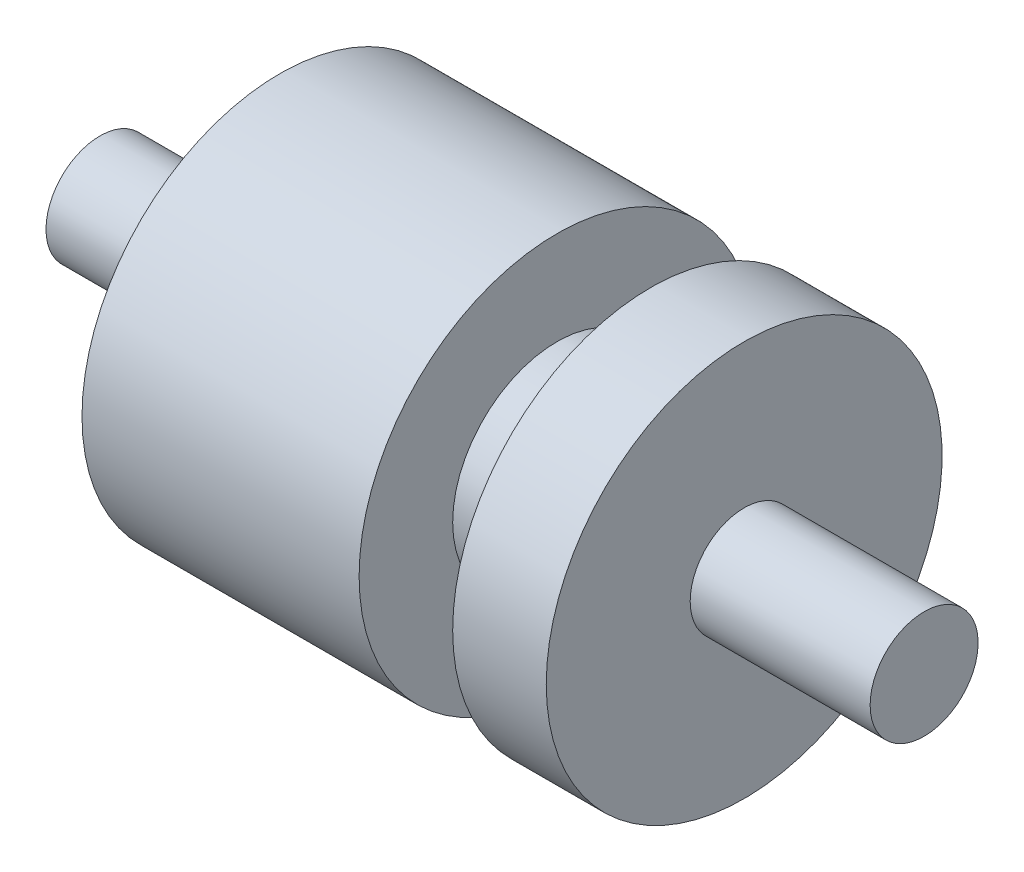
ISO-10303-21;
HEADER;
FILE_DESCRIPTION(('STEP AP214'),'2;1');
FILE_NAME('part.step','',(''),(''),'','','');
FILE_SCHEMA(('AUTOMOTIVE_DESIGN { 1 0 10303 214 1 1 1 1 }'));
ENDSEC;
DATA;
#1=APPLICATION_CONTEXT('core data for automotive mechanical design processes');
#2=APPLICATION_PROTOCOL_DEFINITION('international standard','automotive_design',2000,#1);
#3=PRODUCT_CONTEXT('',#1,'mechanical');
#4=PRODUCT('Part','Part','',(#3));
#5=PRODUCT_RELATED_PRODUCT_CATEGORY('part','',(#4));
#6=PRODUCT_DEFINITION_FORMATION('','',#4);
#7=PRODUCT_DEFINITION_CONTEXT('part definition',#1,'design');
#8=PRODUCT_DEFINITION('design','',#6,#7);
#9=PRODUCT_DEFINITION_SHAPE('','',#8);
#10=(LENGTH_UNIT() NAMED_UNIT(*) SI_UNIT(.MILLI.,.METRE.));
#11=(NAMED_UNIT(*) PLANE_ANGLE_UNIT() SI_UNIT($,.RADIAN.));
#12=(NAMED_UNIT(*) SI_UNIT($,.STERADIAN.) SOLID_ANGLE_UNIT());
#13=UNCERTAINTY_MEASURE_WITH_UNIT(LENGTH_MEASURE(1.E-05),#10,'distance_accuracy_value','');
#14=(GEOMETRIC_REPRESENTATION_CONTEXT(3) GLOBAL_UNCERTAINTY_ASSIGNED_CONTEXT((#13)) GLOBAL_UNIT_ASSIGNED_CONTEXT((#10,
#11,#12)) REPRESENTATION_CONTEXT('',''));
#15=CARTESIAN_POINT('',(0.,0.,0.));
#16=DIRECTION('',(0.,0.,1.));
#17=DIRECTION('',(1.,0.,0.));
#18=AXIS2_PLACEMENT_3D('',#15,#16,#17);
#19=CARTESIAN_POINT('',(-22.9,1.5,0.));
#20=DIRECTION('',(1.,0.,0.));
#21=DIRECTION('',(0.,0.,-1.));
#22=AXIS2_PLACEMENT_3D('',#19,#20,#21);
#23=PLANE('',#22);
#24=CARTESIAN_POINT('',(-22.9,0.,0.));
#25=DIRECTION('',(-1.,0.,0.));
#26=DIRECTION('',(0.,0.,1.));
#27=AXIS2_PLACEMENT_3D('',#24,#25,#26);
#28=CIRCLE('',#27,1.5);
#29=CARTESIAN_POINT('',(-22.9,0.,1.5));
#30=VERTEX_POINT('',#29);
#31=EDGE_CURVE('E65',#30,#30,#28,.T.);
#32=ORIENTED_EDGE('',*,*,#31,.T.);
#33=EDGE_LOOP('',(#32));
#34=FACE_BOUND('',#33,.T.);
#35=ADVANCED_FACE('F31',(#34),#23,.F.);
#36=CARTESIAN_POINT('',(0.,0.,0.));
#37=DIRECTION('',(-1.,0.,0.));
#38=DIRECTION('',(0.,0.,1.));
#39=AXIS2_PLACEMENT_3D('',#36,#37,#38);
#40=PLANE('',#39);
#41=CARTESIAN_POINT('',(0.,0.,0.));
#42=DIRECTION('',(-1.,0.,0.));
#43=DIRECTION('',(0.,0.,1.));
#44=AXIS2_PLACEMENT_3D('',#41,#42,#43);
#45=CIRCLE('',#44,1.5);
#46=CARTESIAN_POINT('',(0.,0.,1.5));
#47=VERTEX_POINT('',#46);
#48=EDGE_CURVE('E10',#47,#47,#45,.T.);
#49=ORIENTED_EDGE('',*,*,#48,.F.);
#50=EDGE_LOOP('',(#49));
#51=FACE_BOUND('',#50,.T.);
#52=ADVANCED_FACE('F119',(#51),#40,.F.);
#53=CARTESIAN_POINT('',(-68.0943285523418,0.,0.));
#54=DIRECTION('',(-1.,0.,0.));
#55=DIRECTION('',(0.,0.,1.));
#56=AXIS2_PLACEMENT_3D('',#53,#54,#55);
#57=CYLINDRICAL_SURFACE('',#56,1.5);
#58=CARTESIAN_POINT('',(-5.00000000000002,0.,0.));
#59=DIRECTION('',(-1.,0.,0.));
#60=DIRECTION('',(0.,0.,1.));
#61=AXIS2_PLACEMENT_3D('',#58,#59,#60);
#62=CIRCLE('',#61,1.5);
#63=CARTESIAN_POINT('',(-5.00000000000002,0.,1.5));
#64=VERTEX_POINT('',#63);
#65=EDGE_CURVE('E37',#64,#64,#62,.T.);
#66=ORIENTED_EDGE('',*,*,#65,.F.);
#67=EDGE_LOOP('',(#66));
#68=FACE_BOUND('',#67,.T.);
#69=ORIENTED_EDGE('',*,*,#48,.T.);
#70=EDGE_LOOP('',(#69));
#71=FACE_BOUND('',#70,.T.);
#72=ADVANCED_FACE('F114',(#68,#71),#57,.T.);
#73=CARTESIAN_POINT('',(-5.00000000000002,5.5,0.));
#74=DIRECTION('',(-1.,0.,0.));
#75=DIRECTION('',(0.,0.,1.));
#76=AXIS2_PLACEMENT_3D('',#73,#74,#75);
#77=PLANE('',#76);
#78=CARTESIAN_POINT('',(-5.00000000000002,0.,0.));
#79=DIRECTION('',(-1.,0.,0.));
#80=DIRECTION('',(0.,0.,1.));
#81=AXIS2_PLACEMENT_3D('',#78,#79,#80);
#82=CIRCLE('',#81,5.5);
#83=CARTESIAN_POINT('',(-5.00000000000002,0.,5.5));
#84=VERTEX_POINT('',#83);
#85=EDGE_CURVE('E41',#84,#84,#82,.T.);
#86=ORIENTED_EDGE('',*,*,#85,.F.);
#87=EDGE_LOOP('',(#86));
#88=FACE_BOUND('',#87,.T.);
#89=ORIENTED_EDGE('',*,*,#65,.T.);
#90=EDGE_LOOP('',(#89));
#91=FACE_BOUND('',#90,.T.);
#92=ADVANCED_FACE('F109',(#88,#91),#77,.F.);
#93=CARTESIAN_POINT('',(-68.0943285523418,0.,0.));
#94=DIRECTION('',(-1.,0.,0.));
#95=DIRECTION('',(0.,0.,1.));
#96=AXIS2_PLACEMENT_3D('',#93,#94,#95);
#97=CYLINDRICAL_SURFACE('',#96,5.5);
#98=CARTESIAN_POINT('',(-7.60000000000002,0.,0.));
#99=DIRECTION('',(-1.,0.,0.));
#100=DIRECTION('',(0.,0.,1.));
#101=AXIS2_PLACEMENT_3D('',#98,#99,#100);
#102=CIRCLE('',#101,5.5);
#103=CARTESIAN_POINT('',(-7.60000000000002,0.,5.5));
#104=VERTEX_POINT('',#103);
#105=EDGE_CURVE('E45',#104,#104,#102,.T.);
#106=ORIENTED_EDGE('',*,*,#105,.F.);
#107=EDGE_LOOP('',(#106));
#108=FACE_BOUND('',#107,.T.);
#109=ORIENTED_EDGE('',*,*,#85,.T.);
#110=EDGE_LOOP('',(#109));
#111=FACE_BOUND('',#110,.T.);
#112=ADVANCED_FACE('F103',(#108,#111),#97,.T.);
#113=CARTESIAN_POINT('',(-7.60000000000002,2.9,0.));
#114=DIRECTION('',(1.,0.,0.));
#115=DIRECTION('',(0.,0.,-1.));
#116=AXIS2_PLACEMENT_3D('',#113,#114,#115);
#117=PLANE('',#116);
#118=CARTESIAN_POINT('',(-7.60000000000002,0.,0.));
#119=DIRECTION('',(-1.,0.,0.));
#120=DIRECTION('',(0.,0.,1.));
#121=AXIS2_PLACEMENT_3D('',#118,#119,#120);
#122=CIRCLE('',#121,2.9);
#123=CARTESIAN_POINT('',(-7.60000000000002,0.,2.9));
#124=VERTEX_POINT('',#123);
#125=EDGE_CURVE('E50',#124,#124,#122,.T.);
#126=ORIENTED_EDGE('',*,*,#125,.F.);
#127=EDGE_LOOP('',(#126));
#128=FACE_BOUND('',#127,.T.);
#129=ORIENTED_EDGE('',*,*,#105,.T.);
#130=EDGE_LOOP('',(#129));
#131=FACE_BOUND('',#130,.T.);
#132=ADVANCED_FACE('F97',(#128,#131),#117,.F.);
#133=CARTESIAN_POINT('',(-68.0943285523418,0.,0.));
#134=DIRECTION('',(-1.,0.,0.));
#135=DIRECTION('',(0.,0.,1.));
#136=AXIS2_PLACEMENT_3D('',#133,#134,#135);
#137=CYLINDRICAL_SURFACE('',#136,2.9);
#138=CARTESIAN_POINT('',(-10.2,0.,0.));
#139=DIRECTION('',(-1.,0.,0.));
#140=DIRECTION('',(0.,0.,1.));
#141=AXIS2_PLACEMENT_3D('',#138,#139,#140);
#142=CIRCLE('',#141,2.9);
#143=CARTESIAN_POINT('',(-10.2,0.,2.9));
#144=VERTEX_POINT('',#143);
#145=EDGE_CURVE('E53',#144,#144,#142,.T.);
#146=ORIENTED_EDGE('',*,*,#145,.F.);
#147=EDGE_LOOP('',(#146));
#148=FACE_BOUND('',#147,.T.);
#149=ORIENTED_EDGE('',*,*,#125,.T.);
#150=EDGE_LOOP('',(#149));
#151=FACE_BOUND('',#150,.T.);
#152=ADVANCED_FACE('F91',(#148,#151),#137,.T.);
#153=CARTESIAN_POINT('',(-10.2,5.5,0.));
#154=DIRECTION('',(-1.,0.,0.));
#155=DIRECTION('',(0.,0.,1.));
#156=AXIS2_PLACEMENT_3D('',#153,#154,#155);
#157=PLANE('',#156);
#158=CARTESIAN_POINT('',(-10.2,0.,0.));
#159=DIRECTION('',(-1.,0.,0.));
#160=DIRECTION('',(0.,0.,1.));
#161=AXIS2_PLACEMENT_3D('',#158,#159,#160);
#162=CIRCLE('',#161,5.5);
#163=CARTESIAN_POINT('',(-10.2,0.,5.5));
#164=VERTEX_POINT('',#163);
#165=EDGE_CURVE('E56',#164,#164,#162,.T.);
#166=ORIENTED_EDGE('',*,*,#165,.F.);
#167=EDGE_LOOP('',(#166));
#168=FACE_BOUND('',#167,.T.);
#169=ORIENTED_EDGE('',*,*,#145,.T.);
#170=EDGE_LOOP('',(#169));
#171=FACE_BOUND('',#170,.T.);
#172=ADVANCED_FACE('F85',(#168,#171),#157,.F.);
#173=CARTESIAN_POINT('',(-68.0943285523418,0.,0.));
#174=DIRECTION('',(-1.,0.,0.));
#175=DIRECTION('',(0.,0.,1.));
#176=AXIS2_PLACEMENT_3D('',#173,#174,#175);
#177=CYLINDRICAL_SURFACE('',#176,5.5);
#178=CARTESIAN_POINT('',(-17.9,0.,0.));
#179=DIRECTION('',(-1.,0.,0.));
#180=DIRECTION('',(0.,0.,1.));
#181=AXIS2_PLACEMENT_3D('',#178,#179,#180);
#182=CIRCLE('',#181,5.5);
#183=CARTESIAN_POINT('',(-17.9,0.,5.5));
#184=VERTEX_POINT('',#183);
#185=EDGE_CURVE('E59',#184,#184,#182,.T.);
#186=ORIENTED_EDGE('',*,*,#185,.F.);
#187=EDGE_LOOP('',(#186));
#188=FACE_BOUND('',#187,.T.);
#189=ORIENTED_EDGE('',*,*,#165,.T.);
#190=EDGE_LOOP('',(#189));
#191=FACE_BOUND('',#190,.T.);
#192=ADVANCED_FACE('F79',(#188,#191),#177,.T.);
#193=CARTESIAN_POINT('',(-17.9,1.5,0.));
#194=DIRECTION('',(1.,0.,0.));
#195=DIRECTION('',(0.,0.,-1.));
#196=AXIS2_PLACEMENT_3D('',#193,#194,#195);
#197=PLANE('',#196);
#198=CARTESIAN_POINT('',(-17.9,0.,0.));
#199=DIRECTION('',(-1.,0.,0.));
#200=DIRECTION('',(0.,0.,1.));
#201=AXIS2_PLACEMENT_3D('',#198,#199,#200);
#202=CIRCLE('',#201,1.5);
#203=CARTESIAN_POINT('',(-17.9,0.,1.5));
#204=VERTEX_POINT('',#203);
#205=EDGE_CURVE('E62',#204,#204,#202,.T.);
#206=ORIENTED_EDGE('',*,*,#205,.F.);
#207=EDGE_LOOP('',(#206));
#208=FACE_BOUND('',#207,.T.);
#209=ORIENTED_EDGE('',*,*,#185,.T.);
#210=EDGE_LOOP('',(#209));
#211=FACE_BOUND('',#210,.T.);
#212=ADVANCED_FACE('F73',(#208,#211),#197,.F.);
#213=CARTESIAN_POINT('',(-68.0943285523418,0.,0.));
#214=DIRECTION('',(-1.,0.,0.));
#215=DIRECTION('',(0.,0.,1.));
#216=AXIS2_PLACEMENT_3D('',#213,#214,#215);
#217=CYLINDRICAL_SURFACE('',#216,1.5);
#218=ORIENTED_EDGE('',*,*,#31,.F.);
#219=EDGE_LOOP('',(#218));
#220=FACE_BOUND('',#219,.T.);
#221=ORIENTED_EDGE('',*,*,#205,.T.);
#222=EDGE_LOOP('',(#221));
#223=FACE_BOUND('',#222,.T.);
#224=ADVANCED_FACE('F70',(#220,#223),#217,.T.);
#225=CLOSED_SHELL('',(#35,#52,#72,#92,#112,#132,#152,#172,#192,#212,#224));
#226=MANIFOLD_SOLID_BREP('B2',#225);
#227=ADVANCED_BREP_SHAPE_REPRESENTATION('',(#18,#226),#14);
#228=SHAPE_DEFINITION_REPRESENTATION(#9,#227);
ENDSEC;
END-ISO-10303-21;
